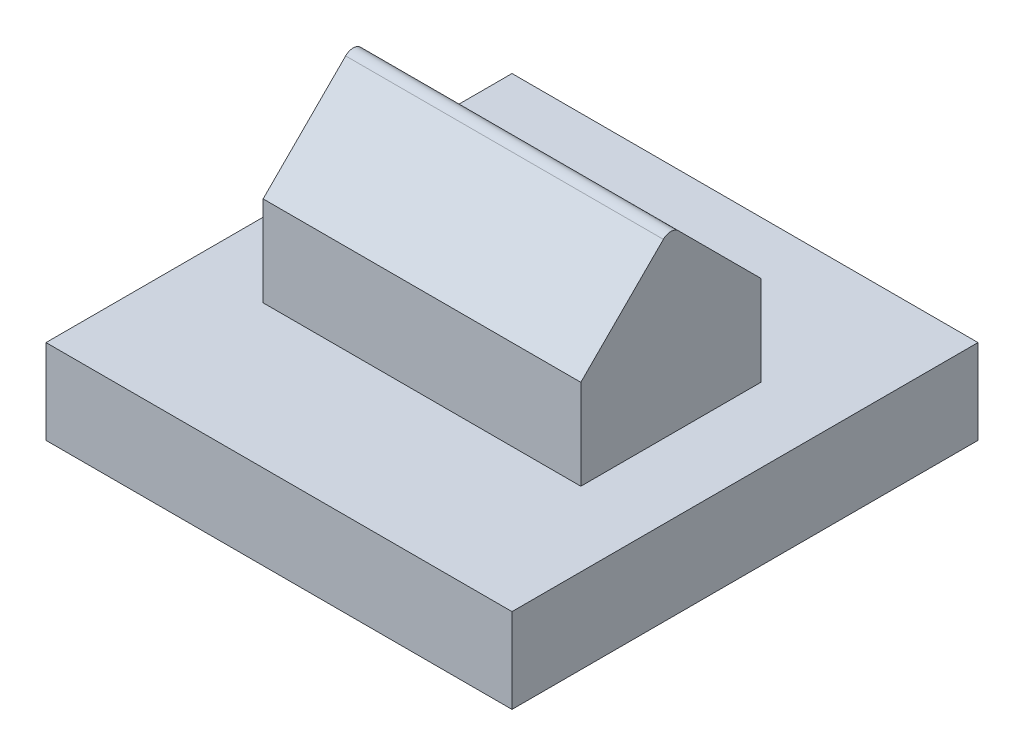
ISO-10303-21;
HEADER;
FILE_DESCRIPTION(('STEP AP214'),'2;1');
FILE_NAME('part.step','',(''),(''),'','','');
FILE_SCHEMA(('AUTOMOTIVE_DESIGN { 1 0 10303 214 1 1 1 1 }'));
ENDSEC;
DATA;
#1=APPLICATION_CONTEXT('core data for automotive mechanical design processes');
#2=APPLICATION_PROTOCOL_DEFINITION('international standard','automotive_design',2000,#1);
#3=PRODUCT_CONTEXT('',#1,'mechanical');
#4=PRODUCT('Part','Part','',(#3));
#5=PRODUCT_RELATED_PRODUCT_CATEGORY('part','',(#4));
#6=PRODUCT_DEFINITION_FORMATION('','',#4);
#7=PRODUCT_DEFINITION_CONTEXT('part definition',#1,'design');
#8=PRODUCT_DEFINITION('design','',#6,#7);
#9=PRODUCT_DEFINITION_SHAPE('','',#8);
#10=(LENGTH_UNIT() NAMED_UNIT(*) SI_UNIT(.MILLI.,.METRE.));
#11=(NAMED_UNIT(*) PLANE_ANGLE_UNIT() SI_UNIT($,.RADIAN.));
#12=(NAMED_UNIT(*) SI_UNIT($,.STERADIAN.) SOLID_ANGLE_UNIT());
#13=UNCERTAINTY_MEASURE_WITH_UNIT(LENGTH_MEASURE(1.E-05),#10,'distance_accuracy_value','');
#14=(GEOMETRIC_REPRESENTATION_CONTEXT(3) GLOBAL_UNCERTAINTY_ASSIGNED_CONTEXT((#13)) GLOBAL_UNIT_ASSIGNED_CONTEXT((#10,
#11,#12)) REPRESENTATION_CONTEXT('',''));
#15=CARTESIAN_POINT('',(0.,0.,0.));
#16=DIRECTION('',(0.,0.,1.));
#17=DIRECTION('',(1.,0.,0.));
#18=AXIS2_PLACEMENT_3D('',#15,#16,#17);
#19=CARTESIAN_POINT('',(0.,0.,-22.));
#20=DIRECTION('',(0.,1.,0.));
#21=DIRECTION('',(-1.,0.,0.));
#22=AXIS2_PLACEMENT_3D('',#19,#20,#21);
#23=PLANE('',#22);
#24=DIRECTION('',(0.,0.,1.));
#25=VECTOR('',#24,1.);
#26=CARTESIAN_POINT('',(-22.,0.,-22.));
#27=LINE('',#26,#25);
#28=CARTESIAN_POINT('',(-22.,0.,-22.));
#29=VERTEX_POINT('',#28);
#30=CARTESIAN_POINT('',(-22.,0.,22.));
#31=VERTEX_POINT('',#30);
#32=EDGE_CURVE('E45',#29,#31,#27,.T.);
#33=ORIENTED_EDGE('',*,*,#32,.T.);
#34=DIRECTION('',(-1.,0.,0.));
#35=VECTOR('',#34,1.);
#36=CARTESIAN_POINT('',(0.,0.,22.));
#37=LINE('',#36,#35);
#38=CARTESIAN_POINT('',(22.,0.,22.));
#39=VERTEX_POINT('',#38);
#40=EDGE_CURVE('E170',#39,#31,#37,.T.);
#41=ORIENTED_EDGE('',*,*,#40,.F.);
#42=DIRECTION('',(0.,0.,1.));
#43=VECTOR('',#42,1.);
#44=CARTESIAN_POINT('',(22.,0.,-22.));
#45=LINE('',#44,#43);
#46=CARTESIAN_POINT('',(22.,0.,-22.));
#47=VERTEX_POINT('',#46);
#48=EDGE_CURVE('E11',#47,#39,#45,.T.);
#49=ORIENTED_EDGE('',*,*,#48,.F.);
#50=DIRECTION('',(-1.,0.,0.));
#51=VECTOR('',#50,1.);
#52=CARTESIAN_POINT('',(0.,0.,-22.));
#53=LINE('',#52,#51);
#54=EDGE_CURVE('E182',#47,#29,#53,.T.);
#55=ORIENTED_EDGE('',*,*,#54,.T.);
#56=EDGE_LOOP('',(#33,#41,#49,#55));
#57=FACE_BOUND('',#56,.T.);
#58=DIRECTION('',(0.,0.,-1.));
#59=VECTOR('',#58,1.);
#60=CARTESIAN_POINT('',(15.,0.,8.5));
#61=LINE('',#60,#59);
#62=CARTESIAN_POINT('',(15.,0.,8.5));
#63=VERTEX_POINT('',#62);
#64=CARTESIAN_POINT('',(15.,0.,-8.5));
#65=VERTEX_POINT('',#64);
#66=EDGE_CURVE('E150',#63,#65,#61,.T.);
#67=ORIENTED_EDGE('',*,*,#66,.F.);
#68=DIRECTION('',(-1.,0.,0.));
#69=VECTOR('',#68,1.);
#70=CARTESIAN_POINT('',(15.,0.,8.5));
#71=LINE('',#70,#69);
#72=CARTESIAN_POINT('',(-15.,0.,8.5));
#73=VERTEX_POINT('',#72);
#74=EDGE_CURVE('E58',#63,#73,#71,.T.);
#75=ORIENTED_EDGE('',*,*,#74,.T.);
#76=DIRECTION('',(0.,0.,-1.));
#77=VECTOR('',#76,1.);
#78=CARTESIAN_POINT('',(-15.,0.,8.5));
#79=LINE('',#78,#77);
#80=CARTESIAN_POINT('',(-15.,0.,-8.5));
#81=VERTEX_POINT('',#80);
#82=EDGE_CURVE('E62',#73,#81,#79,.T.);
#83=ORIENTED_EDGE('',*,*,#82,.T.);
#84=DIRECTION('',(-1.,0.,0.));
#85=VECTOR('',#84,1.);
#86=CARTESIAN_POINT('',(15.,0.,-8.5));
#87=LINE('',#86,#85);
#88=EDGE_CURVE('E127',#65,#81,#87,.T.);
#89=ORIENTED_EDGE('',*,*,#88,.F.);
#90=EDGE_LOOP('',(#67,#75,#83,#89));
#91=FACE_BOUND('',#90,.T.);
#92=ADVANCED_FACE('F41',(#57,#91),#23,.T.);
#93=CARTESIAN_POINT('',(22.,0.,-22.));
#94=DIRECTION('',(1.,0.,0.));
#95=DIRECTION('',(0.,1.,0.));
#96=AXIS2_PLACEMENT_3D('',#93,#94,#95);
#97=PLANE('',#96);
#98=ORIENTED_EDGE('',*,*,#48,.T.);
#99=DIRECTION('',(0.,1.,0.));
#100=VECTOR('',#99,1.);
#101=CARTESIAN_POINT('',(22.,0.,22.));
#102=LINE('',#101,#100);
#103=CARTESIAN_POINT('',(22.,-8.,22.));
#104=VERTEX_POINT('',#103);
#105=EDGE_CURVE('E179',#104,#39,#102,.T.);
#106=ORIENTED_EDGE('',*,*,#105,.F.);
#107=DIRECTION('',(0.,0.,1.));
#108=VECTOR('',#107,1.);
#109=CARTESIAN_POINT('',(22.,-8.,-22.));
#110=LINE('',#109,#108);
#111=CARTESIAN_POINT('',(22.,-8.,-22.));
#112=VERTEX_POINT('',#111);
#113=EDGE_CURVE('E50',#112,#104,#110,.T.);
#114=ORIENTED_EDGE('',*,*,#113,.F.);
#115=DIRECTION('',(0.,1.,0.));
#116=VECTOR('',#115,1.);
#117=CARTESIAN_POINT('',(22.,0.,-22.));
#118=LINE('',#117,#116);
#119=EDGE_CURVE('E190',#112,#47,#118,.T.);
#120=ORIENTED_EDGE('',*,*,#119,.T.);
#121=EDGE_LOOP('',(#98,#106,#114,#120));
#122=FACE_BOUND('',#121,.T.);
#123=ADVANCED_FACE('F206',(#122),#97,.T.);
#124=CARTESIAN_POINT('',(0.,-8.,-22.));
#125=DIRECTION('',(0.,-1.,0.));
#126=DIRECTION('',(0.,0.,-1.));
#127=AXIS2_PLACEMENT_3D('',#124,#125,#126);
#128=PLANE('',#127);
#129=ORIENTED_EDGE('',*,*,#113,.T.);
#130=DIRECTION('',(1.,0.,0.));
#131=VECTOR('',#130,1.);
#132=CARTESIAN_POINT('',(0.,-8.,22.));
#133=LINE('',#132,#131);
#134=CARTESIAN_POINT('',(-22.,-8.,22.));
#135=VERTEX_POINT('',#134);
#136=EDGE_CURVE('E176',#135,#104,#133,.T.);
#137=ORIENTED_EDGE('',*,*,#136,.F.);
#138=DIRECTION('',(0.,0.,1.));
#139=VECTOR('',#138,1.);
#140=CARTESIAN_POINT('',(-22.,-8.,-22.));
#141=LINE('',#140,#139);
#142=CARTESIAN_POINT('',(-22.,-8.,-22.));
#143=VERTEX_POINT('',#142);
#144=EDGE_CURVE('E193',#143,#135,#141,.T.);
#145=ORIENTED_EDGE('',*,*,#144,.F.);
#146=DIRECTION('',(1.,0.,0.));
#147=VECTOR('',#146,1.);
#148=CARTESIAN_POINT('',(0.,-8.,-22.));
#149=LINE('',#148,#147);
#150=EDGE_CURVE('E188',#143,#112,#149,.T.);
#151=ORIENTED_EDGE('',*,*,#150,.T.);
#152=EDGE_LOOP('',(#129,#137,#145,#151));
#153=FACE_BOUND('',#152,.T.);
#154=ADVANCED_FACE('F212',(#153),#128,.T.);
#155=CARTESIAN_POINT('',(-22.,0.,-22.));
#156=DIRECTION('',(-1.,0.,0.));
#157=DIRECTION('',(0.,0.,1.));
#158=AXIS2_PLACEMENT_3D('',#155,#156,#157);
#159=PLANE('',#158);
#160=ORIENTED_EDGE('',*,*,#144,.T.);
#161=DIRECTION('',(0.,-1.,0.));
#162=VECTOR('',#161,1.);
#163=CARTESIAN_POINT('',(-22.,0.,22.));
#164=LINE('',#163,#162);
#165=EDGE_CURVE('E173',#31,#135,#164,.T.);
#166=ORIENTED_EDGE('',*,*,#165,.F.);
#167=ORIENTED_EDGE('',*,*,#32,.F.);
#168=DIRECTION('',(0.,-1.,0.));
#169=VECTOR('',#168,1.);
#170=CARTESIAN_POINT('',(-22.,0.,-22.));
#171=LINE('',#170,#169);
#172=EDGE_CURVE('E185',#29,#143,#171,.T.);
#173=ORIENTED_EDGE('',*,*,#172,.T.);
#174=EDGE_LOOP('',(#160,#166,#167,#173));
#175=FACE_BOUND('',#174,.T.);
#176=ADVANCED_FACE('F43',(#175),#159,.T.);
#177=CARTESIAN_POINT('',(0.,0.,-22.));
#178=DIRECTION('',(0.,0.,1.));
#179=DIRECTION('',(1.,0.,0.));
#180=AXIS2_PLACEMENT_3D('',#177,#178,#179);
#181=PLANE('',#180);
#182=ORIENTED_EDGE('',*,*,#54,.F.);
#183=ORIENTED_EDGE('',*,*,#119,.F.);
#184=ORIENTED_EDGE('',*,*,#150,.F.);
#185=ORIENTED_EDGE('',*,*,#172,.F.);
#186=EDGE_LOOP('',(#182,#183,#184,#185));
#187=FACE_BOUND('',#186,.T.);
#188=ADVANCED_FACE('F210',(#187),#181,.F.);
#189=CARTESIAN_POINT('',(0.,0.,22.));
#190=DIRECTION('',(0.,0.,1.));
#191=DIRECTION('',(1.,0.,0.));
#192=AXIS2_PLACEMENT_3D('',#189,#190,#191);
#193=PLANE('',#192);
#194=ORIENTED_EDGE('',*,*,#40,.T.);
#195=ORIENTED_EDGE('',*,*,#165,.T.);
#196=ORIENTED_EDGE('',*,*,#136,.T.);
#197=ORIENTED_EDGE('',*,*,#105,.T.);
#198=EDGE_LOOP('',(#194,#195,#196,#197));
#199=FACE_BOUND('',#198,.T.);
#200=ADVANCED_FACE('F202',(#199),#193,.T.);
#201=CARTESIAN_POINT('',(15.,8.5,-8.5));
#202=DIRECTION('',(0.,0.,1.));
#203=DIRECTION('',(1.,0.,0.));
#204=AXIS2_PLACEMENT_3D('',#201,#202,#203);
#205=PLANE('',#204);
#206=ORIENTED_EDGE('',*,*,#88,.T.);
#207=DIRECTION('',(0.,1.,0.));
#208=VECTOR('',#207,1.);
#209=CARTESIAN_POINT('',(-15.,8.5,-8.5));
#210=LINE('',#209,#208);
#211=CARTESIAN_POINT('',(-15.,8.5,-8.5));
#212=VERTEX_POINT('',#211);
#213=EDGE_CURVE('E134',#81,#212,#210,.T.);
#214=ORIENTED_EDGE('',*,*,#213,.T.);
#215=DIRECTION('',(-1.,0.,0.));
#216=VECTOR('',#215,1.);
#217=CARTESIAN_POINT('',(15.,8.5,-8.5));
#218=LINE('',#217,#216);
#219=CARTESIAN_POINT('',(15.,8.5,-8.5));
#220=VERTEX_POINT('',#219);
#221=EDGE_CURVE('E118',#220,#212,#218,.T.);
#222=ORIENTED_EDGE('',*,*,#221,.F.);
#223=DIRECTION('',(0.,1.,0.));
#224=VECTOR('',#223,1.);
#225=CARTESIAN_POINT('',(15.,8.5,-8.5));
#226=LINE('',#225,#224);
#227=EDGE_CURVE('E153',#65,#220,#226,.T.);
#228=ORIENTED_EDGE('',*,*,#227,.F.);
#229=EDGE_LOOP('',(#206,#214,#222,#228));
#230=FACE_BOUND('',#229,.T.);
#231=ADVANCED_FACE('F139',(#230),#205,.F.);
#232=CARTESIAN_POINT('',(15.,8.5,-8.5));
#233=DIRECTION('',(0.,-0.707106781186544,0.707106781186551));
#234=DIRECTION('',(0.,-0.707106781186551,-0.707106781186544));
#235=AXIS2_PLACEMENT_3D('',#232,#233,#234);
#236=PLANE('',#235);
#237=ORIENTED_EDGE('',*,*,#221,.T.);
#238=DIRECTION('',(0.,0.707106781186551,0.707106781186544));
#239=VECTOR('',#238,1.);
#240=CARTESIAN_POINT('',(-15.,8.5,-8.5));
#241=LINE('',#240,#239);
#242=CARTESIAN_POINT('',(-15.,16.2928932188134,-0.707106781186666));
#243=VERTEX_POINT('',#242);
#244=EDGE_CURVE('E122',#212,#243,#241,.T.);
#245=ORIENTED_EDGE('',*,*,#244,.T.);
#246=DIRECTION('',(-1.,0.,0.));
#247=VECTOR('',#246,1.);
#248=CARTESIAN_POINT('',(15.,16.2928932188134,-0.707106781186666));
#249=LINE('',#248,#247);
#250=CARTESIAN_POINT('',(15.,16.2928932188134,-0.707106781186666));
#251=VERTEX_POINT('',#250);
#252=EDGE_CURVE('E128',#251,#243,#249,.T.);
#253=ORIENTED_EDGE('',*,*,#252,.F.);
#254=DIRECTION('',(0.,0.707106781186551,0.707106781186544));
#255=VECTOR('',#254,1.);
#256=CARTESIAN_POINT('',(15.,8.5,-8.5));
#257=LINE('',#256,#255);
#258=EDGE_CURVE('E123',#220,#251,#257,.T.);
#259=ORIENTED_EDGE('',*,*,#258,.F.);
#260=EDGE_LOOP('',(#237,#245,#253,#259));
#261=FACE_BOUND('',#260,.T.);
#262=ADVANCED_FACE('F120',(#261),#236,.F.);
#263=CARTESIAN_POINT('',(15.,15.585786437627,0.));
#264=DIRECTION('',(-1.,0.,0.));
#265=DIRECTION('',(0.,0.,1.));
#266=AXIS2_PLACEMENT_3D('',#263,#264,#265);
#267=CYLINDRICAL_SURFACE('',#266,1.);
#268=ORIENTED_EDGE('',*,*,#252,.T.);
#269=CARTESIAN_POINT('',(-15.,15.585786437627,0.));
#270=DIRECTION('',(1.,0.,0.));
#271=DIRECTION('',(0.,0.,-1.));
#272=AXIS2_PLACEMENT_3D('',#269,#270,#271);
#273=CIRCLE('',#272,1.);
#274=CARTESIAN_POINT('',(-15.,16.2928932188135,0.707106781186554));
#275=VERTEX_POINT('',#274);
#276=EDGE_CURVE('E137',#243,#275,#273,.T.);
#277=ORIENTED_EDGE('',*,*,#276,.T.);
#278=DIRECTION('',(-1.,0.,0.));
#279=VECTOR('',#278,1.);
#280=CARTESIAN_POINT('',(15.,16.2928932188135,0.707106781186554));
#281=LINE('',#280,#279);
#282=CARTESIAN_POINT('',(15.,16.2928932188135,0.707106781186554));
#283=VERTEX_POINT('',#282);
#284=EDGE_CURVE('E166',#283,#275,#281,.T.);
#285=ORIENTED_EDGE('',*,*,#284,.F.);
#286=CARTESIAN_POINT('',(15.,15.585786437627,0.));
#287=DIRECTION('',(1.,0.,0.));
#288=DIRECTION('',(0.,0.,-1.));
#289=AXIS2_PLACEMENT_3D('',#286,#287,#288);
#290=CIRCLE('',#289,1.);
#291=EDGE_CURVE('E156',#251,#283,#290,.T.);
#292=ORIENTED_EDGE('',*,*,#291,.F.);
#293=EDGE_LOOP('',(#268,#277,#285,#292));
#294=FACE_BOUND('',#293,.T.);
#295=ADVANCED_FACE('F234',(#294),#267,.T.);
#296=CARTESIAN_POINT('',(15.,8.5,8.5));
#297=DIRECTION('',(0.,-0.707106781186544,-0.707106781186551));
#298=DIRECTION('',(0.,0.707106781186551,-0.707106781186544));
#299=AXIS2_PLACEMENT_3D('',#296,#297,#298);
#300=PLANE('',#299);
#301=ORIENTED_EDGE('',*,*,#284,.T.);
#302=DIRECTION('',(0.,-0.707106781186551,0.707106781186544));
#303=VECTOR('',#302,1.);
#304=CARTESIAN_POINT('',(-15.,8.5,8.5));
#305=LINE('',#304,#303);
#306=CARTESIAN_POINT('',(-15.,8.5,8.5));
#307=VERTEX_POINT('',#306);
#308=EDGE_CURVE('E144',#275,#307,#305,.T.);
#309=ORIENTED_EDGE('',*,*,#308,.T.);
#310=DIRECTION('',(-1.,0.,0.));
#311=VECTOR('',#310,1.);
#312=CARTESIAN_POINT('',(15.,8.5,8.5));
#313=LINE('',#312,#311);
#314=CARTESIAN_POINT('',(15.,8.5,8.5));
#315=VERTEX_POINT('',#314);
#316=EDGE_CURVE('E164',#315,#307,#313,.T.);
#317=ORIENTED_EDGE('',*,*,#316,.F.);
#318=DIRECTION('',(0.,-0.707106781186551,0.707106781186544));
#319=VECTOR('',#318,1.);
#320=CARTESIAN_POINT('',(15.,8.5,8.5));
#321=LINE('',#320,#319);
#322=EDGE_CURVE('E158',#283,#315,#321,.T.);
#323=ORIENTED_EDGE('',*,*,#322,.F.);
#324=EDGE_LOOP('',(#301,#309,#317,#323));
#325=FACE_BOUND('',#324,.T.);
#326=ADVANCED_FACE('F237',(#325),#300,.F.);
#327=CARTESIAN_POINT('',(15.,8.5,8.5));
#328=DIRECTION('',(0.,0.,-1.));
#329=DIRECTION('',(0.,1.,0.));
#330=AXIS2_PLACEMENT_3D('',#327,#328,#329);
#331=PLANE('',#330);
#332=ORIENTED_EDGE('',*,*,#316,.T.);
#333=DIRECTION('',(0.,-1.,0.));
#334=VECTOR('',#333,1.);
#335=CARTESIAN_POINT('',(-15.,8.5,8.5));
#336=LINE('',#335,#334);
#337=EDGE_CURVE('E147',#307,#73,#336,.T.);
#338=ORIENTED_EDGE('',*,*,#337,.T.);
#339=ORIENTED_EDGE('',*,*,#74,.F.);
#340=DIRECTION('',(0.,-1.,0.));
#341=VECTOR('',#340,1.);
#342=CARTESIAN_POINT('',(15.,8.5,8.5));
#343=LINE('',#342,#341);
#344=EDGE_CURVE('E160',#315,#63,#343,.T.);
#345=ORIENTED_EDGE('',*,*,#344,.F.);
#346=EDGE_LOOP('',(#332,#338,#339,#345));
#347=FACE_BOUND('',#346,.T.);
#348=ADVANCED_FACE('F241',(#347),#331,.F.);
#349=CARTESIAN_POINT('',(15.,15.585786437627,0.));
#350=DIRECTION('',(1.,0.,0.));
#351=DIRECTION('',(0.,0.,-1.));
#352=AXIS2_PLACEMENT_3D('',#349,#350,#351);
#353=PLANE('',#352);
#354=ORIENTED_EDGE('',*,*,#66,.T.);
#355=ORIENTED_EDGE('',*,*,#227,.T.);
#356=ORIENTED_EDGE('',*,*,#258,.T.);
#357=ORIENTED_EDGE('',*,*,#291,.T.);
#358=ORIENTED_EDGE('',*,*,#322,.T.);
#359=ORIENTED_EDGE('',*,*,#344,.T.);
#360=EDGE_LOOP('',(#354,#355,#356,#357,#358,#359));
#361=FACE_BOUND('',#360,.T.);
#362=ADVANCED_FACE('F245',(#361),#353,.T.);
#363=CARTESIAN_POINT('',(-15.,15.585786437627,0.));
#364=DIRECTION('',(1.,0.,0.));
#365=DIRECTION('',(0.,0.,-1.));
#366=AXIS2_PLACEMENT_3D('',#363,#364,#365);
#367=PLANE('',#366);
#368=ORIENTED_EDGE('',*,*,#82,.F.);
#369=ORIENTED_EDGE('',*,*,#337,.F.);
#370=ORIENTED_EDGE('',*,*,#308,.F.);
#371=ORIENTED_EDGE('',*,*,#276,.F.);
#372=ORIENTED_EDGE('',*,*,#244,.F.);
#373=ORIENTED_EDGE('',*,*,#213,.F.);
#374=EDGE_LOOP('',(#368,#369,#370,#371,#372,#373));
#375=FACE_BOUND('',#374,.T.);
#376=ADVANCED_FACE('F133',(#375),#367,.F.);
#377=CLOSED_SHELL('',(#92,#123,#154,#176,#188,#200,#231,#262,#295,#326,#348,#362,#376));
#378=MANIFOLD_SOLID_BREP('B2',#377);
#379=ADVANCED_BREP_SHAPE_REPRESENTATION('',(#18,#378),#14);
#380=SHAPE_DEFINITION_REPRESENTATION(#9,#379);
ENDSEC;
END-ISO-10303-21;
